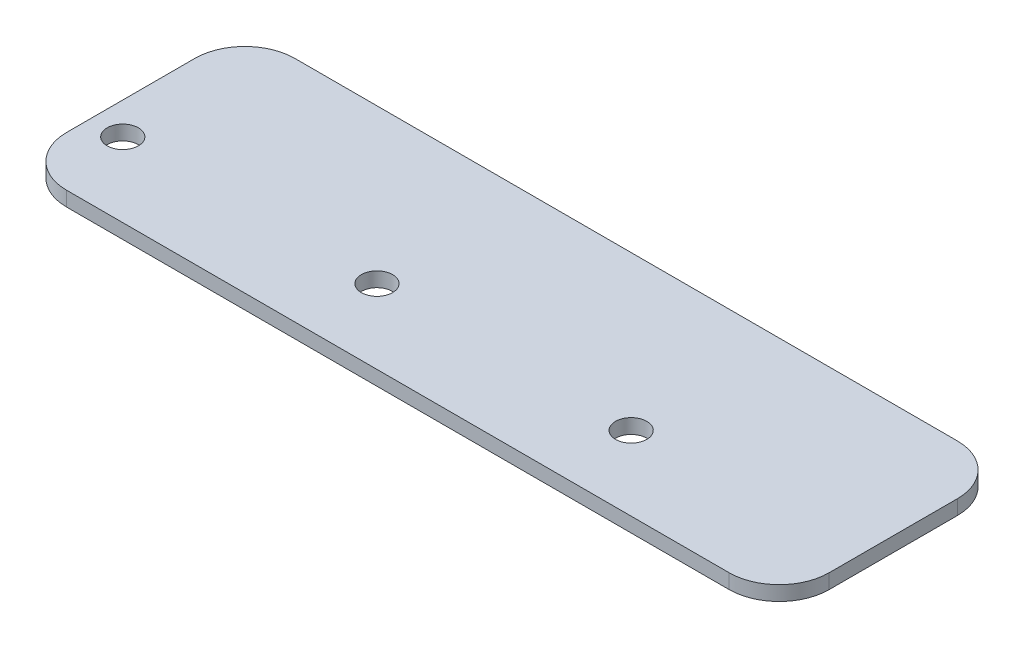
ISO-10303-21;
HEADER;
FILE_DESCRIPTION(('STEP AP214'),'2;1');
FILE_NAME('part.step','',(''),(''),'','','');
FILE_SCHEMA(('AUTOMOTIVE_DESIGN { 1 0 10303 214 1 1 1 1 }'));
ENDSEC;
DATA;
#1=APPLICATION_CONTEXT('core data for automotive mechanical design processes');
#2=APPLICATION_PROTOCOL_DEFINITION('international standard','automotive_design',2000,#1);
#3=PRODUCT_CONTEXT('',#1,'mechanical');
#4=PRODUCT('Part','Part','',(#3));
#5=PRODUCT_RELATED_PRODUCT_CATEGORY('part','',(#4));
#6=PRODUCT_DEFINITION_FORMATION('','',#4);
#7=PRODUCT_DEFINITION_CONTEXT('part definition',#1,'design');
#8=PRODUCT_DEFINITION('design','',#6,#7);
#9=PRODUCT_DEFINITION_SHAPE('','',#8);
#10=(LENGTH_UNIT() NAMED_UNIT(*) SI_UNIT(.MILLI.,.METRE.));
#11=(NAMED_UNIT(*) PLANE_ANGLE_UNIT() SI_UNIT($,.RADIAN.));
#12=(NAMED_UNIT(*) SI_UNIT($,.STERADIAN.) SOLID_ANGLE_UNIT());
#13=UNCERTAINTY_MEASURE_WITH_UNIT(LENGTH_MEASURE(1.E-05),#10,'distance_accuracy_value','');
#14=(GEOMETRIC_REPRESENTATION_CONTEXT(3) GLOBAL_UNCERTAINTY_ASSIGNED_CONTEXT((#13)) GLOBAL_UNIT_ASSIGNED_CONTEXT((#10,
#11,#12)) REPRESENTATION_CONTEXT('',''));
#15=CARTESIAN_POINT('',(0.,0.,0.));
#16=DIRECTION('',(0.,0.,1.));
#17=DIRECTION('',(1.,0.,0.));
#18=AXIS2_PLACEMENT_3D('',#15,#16,#17);
#19=CARTESIAN_POINT('',(60.96,0.,-18.2477776423407));
#20=DIRECTION('',(-1.,0.,0.));
#21=DIRECTION('',(0.,-1.,0.));
#22=AXIS2_PLACEMENT_3D('',#19,#20,#21);
#23=PLANE('',#22);
#24=DIRECTION('',(0.,0.,1.));
#25=VECTOR('',#24,1.);
#26=CARTESIAN_POINT('',(60.96,-1.16839999999995,-18.2477776423407));
#27=LINE('',#26,#25);
#28=CARTESIAN_POINT('',(60.96,-1.16840000000005,-4.));
#29=VERTEX_POINT('',#28);
#30=CARTESIAN_POINT('',(60.96,-1.16839999999997,-14.2477776423407));
#31=VERTEX_POINT('',#30);
#32=EDGE_CURVE('E156',#29,#31,#27,.F.);
#33=ORIENTED_EDGE('',*,*,#32,.T.);
#34=DIRECTION('',(0.,-1.,0.));
#35=VECTOR('',#34,1.);
#36=CARTESIAN_POINT('',(60.96,0.,-14.2477776423407));
#37=LINE('',#36,#35);
#38=CARTESIAN_POINT('',(60.96,0.,-14.2477776423407));
#39=VERTEX_POINT('',#38);
#40=EDGE_CURVE('E133',#31,#39,#37,.F.);
#41=ORIENTED_EDGE('',*,*,#40,.T.);
#42=DIRECTION('',(0.,0.,-1.));
#43=VECTOR('',#42,1.);
#44=CARTESIAN_POINT('',(60.96,0.,-8.0793776423407));
#45=LINE('',#44,#43);
#46=CARTESIAN_POINT('',(60.96,0.,-4.));
#47=VERTEX_POINT('',#46);
#48=EDGE_CURVE('E159',#47,#39,#45,.T.);
#49=ORIENTED_EDGE('',*,*,#48,.F.);
#50=DIRECTION('',(0.,1.,0.));
#51=VECTOR('',#50,1.);
#52=CARTESIAN_POINT('',(60.96,-1.1684,-4.));
#53=LINE('',#52,#51);
#54=EDGE_CURVE('E138',#47,#29,#53,.F.);
#55=ORIENTED_EDGE('',*,*,#54,.T.);
#56=EDGE_LOOP('',(#33,#41,#49,#55));
#57=FACE_BOUND('',#56,.T.);
#58=ADVANCED_FACE('F61',(#57),#23,.F.);
#59=CARTESIAN_POINT('',(0.,0.,-9.24777764234074));
#60=DIRECTION('',(1.,0.,0.));
#61=DIRECTION('',(0.,1.,0.));
#62=AXIS2_PLACEMENT_3D('',#59,#60,#61);
#63=PLANE('',#62);
#64=DIRECTION('',(0.,0.,-1.));
#65=VECTOR('',#64,1.);
#66=CARTESIAN_POINT('',(0.,-1.16840000000001,-9.24777764234074));
#67=LINE('',#66,#65);
#68=CARTESIAN_POINT('',(0.,-1.16839999999997,-14.2477776423407));
#69=VERTEX_POINT('',#68);
#70=CARTESIAN_POINT('',(0.,-1.16840000000005,-4.));
#71=VERTEX_POINT('',#70);
#72=EDGE_CURVE('E155',#69,#71,#67,.F.);
#73=ORIENTED_EDGE('',*,*,#72,.T.);
#74=DIRECTION('',(0.,1.,0.));
#75=VECTOR('',#74,1.);
#76=CARTESIAN_POINT('',(0.,0.,-4.));
#77=LINE('',#76,#75);
#78=CARTESIAN_POINT('',(0.,0.,-4.));
#79=VERTEX_POINT('',#78);
#80=EDGE_CURVE('E13',#71,#79,#77,.T.);
#81=ORIENTED_EDGE('',*,*,#80,.T.);
#82=DIRECTION('',(0.,0.,1.));
#83=VECTOR('',#82,1.);
#84=CARTESIAN_POINT('',(0.,0.,-8.0793776423407));
#85=LINE('',#84,#83);
#86=CARTESIAN_POINT('',(0.,0.,-14.2477776423407));
#87=VERTEX_POINT('',#86);
#88=EDGE_CURVE('E165',#87,#79,#85,.T.);
#89=ORIENTED_EDGE('',*,*,#88,.F.);
#90=DIRECTION('',(0.,-1.,0.));
#91=VECTOR('',#90,1.);
#92=CARTESIAN_POINT('',(0.,0.,-14.2477776423407));
#93=LINE('',#92,#91);
#94=EDGE_CURVE('E69',#87,#69,#93,.T.);
#95=ORIENTED_EDGE('',*,*,#94,.T.);
#96=EDGE_LOOP('',(#73,#81,#89,#95));
#97=FACE_BOUND('',#96,.T.);
#98=ADVANCED_FACE('F186',(#97),#63,.F.);
#99=CARTESIAN_POINT('',(0.,0.,0.));
#100=DIRECTION('',(0.,-1.,0.));
#101=DIRECTION('',(0.,0.,-1.));
#102=AXIS2_PLACEMENT_3D('',#99,#100,#101);
#103=PLANE('',#102);
#104=ORIENTED_EDGE('',*,*,#48,.T.);
#105=CARTESIAN_POINT('',(56.96,0.,-14.2477776423407));
#106=DIRECTION('',(0.,-1.,0.));
#107=DIRECTION('',(0.,0.,-1.));
#108=AXIS2_PLACEMENT_3D('',#105,#106,#107);
#109=CIRCLE('',#108,4.);
#110=CARTESIAN_POINT('',(56.96,0.,-18.2477776423407));
#111=VERTEX_POINT('',#110);
#112=EDGE_CURVE('E177',#39,#111,#109,.F.);
#113=ORIENTED_EDGE('',*,*,#112,.T.);
#114=DIRECTION('',(-1.,0.,0.));
#115=VECTOR('',#114,1.);
#116=CARTESIAN_POINT('',(0.,0.,-18.2477776423407));
#117=LINE('',#116,#115);
#118=CARTESIAN_POINT('',(4.,0.,-18.2477776423407));
#119=VERTEX_POINT('',#118);
#120=EDGE_CURVE('E148',#111,#119,#117,.T.);
#121=ORIENTED_EDGE('',*,*,#120,.T.);
#122=CARTESIAN_POINT('',(4.,0.,-14.2477776423407));
#123=DIRECTION('',(0.,-1.,0.));
#124=DIRECTION('',(0.,0.,-1.));
#125=AXIS2_PLACEMENT_3D('',#122,#123,#124);
#126=CIRCLE('',#125,4.);
#127=EDGE_CURVE('E173',#119,#87,#126,.F.);
#128=ORIENTED_EDGE('',*,*,#127,.T.);
#129=ORIENTED_EDGE('',*,*,#88,.T.);
#130=CARTESIAN_POINT('',(4.,0.,-4.));
#131=DIRECTION('',(0.,-1.,0.));
#132=DIRECTION('',(0.,0.,-1.));
#133=AXIS2_PLACEMENT_3D('',#130,#131,#132);
#134=CIRCLE('',#133,4.);
#135=CARTESIAN_POINT('',(4.,0.,0.));
#136=VERTEX_POINT('',#135);
#137=EDGE_CURVE('E84',#79,#136,#134,.F.);
#138=ORIENTED_EDGE('',*,*,#137,.T.);
#139=DIRECTION('',(1.,0.,0.));
#140=VECTOR('',#139,1.);
#141=CARTESIAN_POINT('',(0.,0.,0.));
#142=LINE('',#141,#140);
#143=CARTESIAN_POINT('',(56.96,0.,0.));
#144=VERTEX_POINT('',#143);
#145=EDGE_CURVE('E161',#136,#144,#142,.T.);
#146=ORIENTED_EDGE('',*,*,#145,.T.);
#147=CARTESIAN_POINT('',(56.96,0.,-4.));
#148=DIRECTION('',(0.,-1.,0.));
#149=DIRECTION('',(0.,0.,-1.));
#150=AXIS2_PLACEMENT_3D('',#147,#148,#149);
#151=CIRCLE('',#150,4.);
#152=EDGE_CURVE('E76',#144,#47,#151,.F.);
#153=ORIENTED_EDGE('',*,*,#152,.T.);
#154=EDGE_LOOP('',(#104,#113,#121,#128,#129,#138,#146,#153));
#155=FACE_BOUND('',#154,.T.);
#156=CARTESIAN_POINT('',(2.55,0.,-5.94));
#157=DIRECTION('',(0.,-1.,0.));
#158=DIRECTION('',(0.,0.,-1.));
#159=AXIS2_PLACEMENT_3D('',#156,#157,#158);
#160=CIRCLE('',#159,1.25);
#161=CARTESIAN_POINT('',(2.55,0.,-7.19));
#162=VERTEX_POINT('',#161);
#163=EDGE_CURVE('E221',#162,#162,#160,.T.);
#164=ORIENTED_EDGE('',*,*,#163,.T.);
#165=EDGE_LOOP('',(#164));
#166=FACE_BOUND('',#165,.T.);
#167=CARTESIAN_POINT('',(22.87,0.,-5.94));
#168=DIRECTION('',(0.,-1.,0.));
#169=DIRECTION('',(0.,0.,-1.));
#170=AXIS2_PLACEMENT_3D('',#167,#168,#169);
#171=CIRCLE('',#170,1.25);
#172=CARTESIAN_POINT('',(22.87,0.,-7.19));
#173=VERTEX_POINT('',#172);
#174=EDGE_CURVE('E224',#173,#173,#171,.T.);
#175=ORIENTED_EDGE('',*,*,#174,.T.);
#176=EDGE_LOOP('',(#175));
#177=FACE_BOUND('',#176,.T.);
#178=CARTESIAN_POINT('',(43.19,0.,-5.94));
#179=DIRECTION('',(0.,-1.,0.));
#180=DIRECTION('',(0.,0.,-1.));
#181=AXIS2_PLACEMENT_3D('',#178,#179,#180);
#182=CIRCLE('',#181,1.25);
#183=CARTESIAN_POINT('',(43.19,0.,-7.19));
#184=VERTEX_POINT('',#183);
#185=EDGE_CURVE('E227',#184,#184,#182,.T.);
#186=ORIENTED_EDGE('',*,*,#185,.T.);
#187=EDGE_LOOP('',(#186));
#188=FACE_BOUND('',#187,.T.);
#189=ADVANCED_FACE('F198',(#155,#166,#177,#188),#103,.F.);
#190=CARTESIAN_POINT('',(0.,-1.16840000000002,-8.07937764234071));
#191=DIRECTION('',(0.,-1.,0.));
#192=DIRECTION('',(0.,0.,-1.));
#193=AXIS2_PLACEMENT_3D('',#190,#191,#192);
#194=PLANE('',#193);
#195=DIRECTION('',(1.,0.,0.));
#196=VECTOR('',#195,1.);
#197=CARTESIAN_POINT('',(0.,-1.16839999999995,-18.2477776423407));
#198=LINE('',#197,#196);
#199=CARTESIAN_POINT('',(56.96,-1.16839999999995,-18.2477776423407));
#200=VERTEX_POINT('',#199);
#201=CARTESIAN_POINT('',(4.,-1.16839999999995,-18.2477776423407));
#202=VERTEX_POINT('',#201);
#203=EDGE_CURVE('E145',#200,#202,#198,.F.);
#204=ORIENTED_EDGE('',*,*,#203,.F.);
#205=CARTESIAN_POINT('',(56.96,-1.16839999999997,-14.2477776423407));
#206=DIRECTION('',(0.,-1.,0.));
#207=DIRECTION('',(0.,0.,-1.));
#208=AXIS2_PLACEMENT_3D('',#205,#206,#207);
#209=CIRCLE('',#208,4.);
#210=EDGE_CURVE('E128',#200,#31,#209,.T.);
#211=ORIENTED_EDGE('',*,*,#210,.T.);
#212=ORIENTED_EDGE('',*,*,#32,.F.);
#213=CARTESIAN_POINT('',(56.96,-1.16840000000004,-4.));
#214=DIRECTION('',(0.,-1.,0.));
#215=DIRECTION('',(0.,0.,-1.));
#216=AXIS2_PLACEMENT_3D('',#213,#214,#215);
#217=CIRCLE('',#216,4.);
#218=CARTESIAN_POINT('',(56.96,-1.1684,0.));
#219=VERTEX_POINT('',#218);
#220=EDGE_CURVE('E139',#29,#219,#217,.T.);
#221=ORIENTED_EDGE('',*,*,#220,.T.);
#222=DIRECTION('',(1.,0.,0.));
#223=VECTOR('',#222,1.);
#224=CARTESIAN_POINT('',(0.,-1.1684,0.));
#225=LINE('',#224,#223);
#226=CARTESIAN_POINT('',(4.,-1.1684,0.));
#227=VERTEX_POINT('',#226);
#228=EDGE_CURVE('E193',#227,#219,#225,.T.);
#229=ORIENTED_EDGE('',*,*,#228,.F.);
#230=CARTESIAN_POINT('',(4.,-1.16840000000004,-4.));
#231=DIRECTION('',(0.,-1.,0.));
#232=DIRECTION('',(0.,0.,-1.));
#233=AXIS2_PLACEMENT_3D('',#230,#231,#232);
#234=CIRCLE('',#233,4.);
#235=EDGE_CURVE('E168',#227,#71,#234,.T.);
#236=ORIENTED_EDGE('',*,*,#235,.T.);
#237=ORIENTED_EDGE('',*,*,#72,.F.);
#238=CARTESIAN_POINT('',(4.,-1.16839999999997,-14.2477776423407));
#239=DIRECTION('',(0.,-1.,0.));
#240=DIRECTION('',(0.,0.,-1.));
#241=AXIS2_PLACEMENT_3D('',#238,#239,#240);
#242=CIRCLE('',#241,4.);
#243=EDGE_CURVE('E149',#69,#202,#242,.T.);
#244=ORIENTED_EDGE('',*,*,#243,.T.);
#245=EDGE_LOOP('',(#204,#211,#212,#221,#229,#236,#237,#244));
#246=FACE_BOUND('',#245,.T.);
#247=CARTESIAN_POINT('',(2.55,-1.1684,-5.94));
#248=DIRECTION('',(0.,-1.,0.));
#249=DIRECTION('',(0.,0.,-1.));
#250=AXIS2_PLACEMENT_3D('',#247,#248,#249);
#251=CIRCLE('',#250,1.25);
#252=CARTESIAN_POINT('',(2.55,-1.1684,-7.19));
#253=VERTEX_POINT('',#252);
#254=EDGE_CURVE('E216',#253,#253,#251,.T.);
#255=ORIENTED_EDGE('',*,*,#254,.F.);
#256=EDGE_LOOP('',(#255));
#257=FACE_BOUND('',#256,.T.);
#258=CARTESIAN_POINT('',(22.87,-1.1684,-5.94));
#259=DIRECTION('',(0.,-1.,0.));
#260=DIRECTION('',(0.,0.,-1.));
#261=AXIS2_PLACEMENT_3D('',#258,#259,#260);
#262=CIRCLE('',#261,1.25);
#263=CARTESIAN_POINT('',(22.87,-1.1684,-7.19));
#264=VERTEX_POINT('',#263);
#265=EDGE_CURVE('E212',#264,#264,#262,.T.);
#266=ORIENTED_EDGE('',*,*,#265,.F.);
#267=EDGE_LOOP('',(#266));
#268=FACE_BOUND('',#267,.T.);
#269=CARTESIAN_POINT('',(43.19,-1.1684,-5.94));
#270=DIRECTION('',(0.,-1.,0.));
#271=DIRECTION('',(0.,0.,-1.));
#272=AXIS2_PLACEMENT_3D('',#269,#270,#271);
#273=CIRCLE('',#272,1.25);
#274=CARTESIAN_POINT('',(43.19,-1.1684,-7.19));
#275=VERTEX_POINT('',#274);
#276=EDGE_CURVE('E210',#275,#275,#273,.T.);
#277=ORIENTED_EDGE('',*,*,#276,.F.);
#278=EDGE_LOOP('',(#277));
#279=FACE_BOUND('',#278,.T.);
#280=ADVANCED_FACE('F152',(#246,#257,#268,#279),#194,.T.);
#281=CARTESIAN_POINT('',(0.,0.,-18.2477776423407));
#282=DIRECTION('',(0.,0.,1.));
#283=DIRECTION('',(0.,-1.,0.));
#284=AXIS2_PLACEMENT_3D('',#281,#282,#283);
#285=PLANE('',#284);
#286=ORIENTED_EDGE('',*,*,#120,.F.);
#287=DIRECTION('',(0.,-1.,0.));
#288=VECTOR('',#287,1.);
#289=CARTESIAN_POINT('',(56.96,0.,-18.2477776423407));
#290=LINE('',#289,#288);
#291=EDGE_CURVE('E132',#111,#200,#290,.T.);
#292=ORIENTED_EDGE('',*,*,#291,.T.);
#293=ORIENTED_EDGE('',*,*,#203,.T.);
#294=DIRECTION('',(0.,-1.,0.));
#295=VECTOR('',#294,1.);
#296=CARTESIAN_POINT('',(4.,0.,-18.2477776423407));
#297=LINE('',#296,#295);
#298=EDGE_CURVE('E150',#202,#119,#297,.F.);
#299=ORIENTED_EDGE('',*,*,#298,.T.);
#300=EDGE_LOOP('',(#286,#292,#293,#299));
#301=FACE_BOUND('',#300,.T.);
#302=ADVANCED_FACE('F144',(#301),#285,.F.);
#303=CARTESIAN_POINT('',(0.,-1.1684,0.));
#304=DIRECTION('',(0.,0.,1.));
#305=DIRECTION('',(1.,0.,0.));
#306=AXIS2_PLACEMENT_3D('',#303,#304,#305);
#307=PLANE('',#306);
#308=ORIENTED_EDGE('',*,*,#228,.T.);
#309=DIRECTION('',(0.,1.,0.));
#310=VECTOR('',#309,1.);
#311=CARTESIAN_POINT('',(56.96,0.,0.));
#312=LINE('',#311,#310);
#313=EDGE_CURVE('E181',#219,#144,#312,.T.);
#314=ORIENTED_EDGE('',*,*,#313,.T.);
#315=ORIENTED_EDGE('',*,*,#145,.F.);
#316=DIRECTION('',(0.,1.,0.));
#317=VECTOR('',#316,1.);
#318=CARTESIAN_POINT('',(4.,-1.1684,0.));
#319=LINE('',#318,#317);
#320=EDGE_CURVE('E179',#136,#227,#319,.F.);
#321=ORIENTED_EDGE('',*,*,#320,.T.);
#322=EDGE_LOOP('',(#308,#314,#315,#321));
#323=FACE_BOUND('',#322,.T.);
#324=ADVANCED_FACE('F209',(#323),#307,.T.);
#325=CARTESIAN_POINT('',(43.19,-1.1684,-5.94));
#326=DIRECTION('',(0.,-1.,0.));
#327=DIRECTION('',(0.,0.,-1.));
#328=AXIS2_PLACEMENT_3D('',#325,#326,#327);
#329=CYLINDRICAL_SURFACE('',#328,1.25);
#330=ORIENTED_EDGE('',*,*,#185,.F.);
#331=EDGE_LOOP('',(#330));
#332=FACE_BOUND('',#331,.T.);
#333=ORIENTED_EDGE('',*,*,#276,.T.);
#334=EDGE_LOOP('',(#333));
#335=FACE_BOUND('',#334,.T.);
#336=ADVANCED_FACE('F233',(#332,#335),#329,.F.);
#337=CARTESIAN_POINT('',(22.87,-1.1684,-5.94));
#338=DIRECTION('',(0.,-1.,0.));
#339=DIRECTION('',(0.,0.,-1.));
#340=AXIS2_PLACEMENT_3D('',#337,#338,#339);
#341=CYLINDRICAL_SURFACE('',#340,1.25);
#342=ORIENTED_EDGE('',*,*,#174,.F.);
#343=EDGE_LOOP('',(#342));
#344=FACE_BOUND('',#343,.T.);
#345=ORIENTED_EDGE('',*,*,#265,.T.);
#346=EDGE_LOOP('',(#345));
#347=FACE_BOUND('',#346,.T.);
#348=ADVANCED_FACE('F235',(#344,#347),#341,.F.);
#349=CARTESIAN_POINT('',(2.55,-1.1684,-5.94));
#350=DIRECTION('',(0.,-1.,0.));
#351=DIRECTION('',(0.,0.,-1.));
#352=AXIS2_PLACEMENT_3D('',#349,#350,#351);
#353=CYLINDRICAL_SURFACE('',#352,1.25);
#354=ORIENTED_EDGE('',*,*,#163,.F.);
#355=EDGE_LOOP('',(#354));
#356=FACE_BOUND('',#355,.T.);
#357=ORIENTED_EDGE('',*,*,#254,.T.);
#358=EDGE_LOOP('',(#357));
#359=FACE_BOUND('',#358,.T.);
#360=ADVANCED_FACE('F240',(#356,#359),#353,.F.);
#361=CARTESIAN_POINT('',(56.96,0.,-14.2477776423407));
#362=DIRECTION('',(0.,-1.,0.));
#363=DIRECTION('',(0.,0.,-1.));
#364=AXIS2_PLACEMENT_3D('',#361,#362,#363);
#365=CYLINDRICAL_SURFACE('',#364,4.);
#366=ORIENTED_EDGE('',*,*,#112,.F.);
#367=ORIENTED_EDGE('',*,*,#40,.F.);
#368=ORIENTED_EDGE('',*,*,#210,.F.);
#369=ORIENTED_EDGE('',*,*,#291,.F.);
#370=EDGE_LOOP('',(#366,#367,#368,#369));
#371=FACE_BOUND('',#370,.T.);
#372=ADVANCED_FACE('F131',(#371),#365,.T.);
#373=CARTESIAN_POINT('',(56.96,-1.1684,-4.));
#374=DIRECTION('',(0.,-1.,0.));
#375=DIRECTION('',(0.,0.,-1.));
#376=AXIS2_PLACEMENT_3D('',#373,#374,#375);
#377=CYLINDRICAL_SURFACE('',#376,4.);
#378=ORIENTED_EDGE('',*,*,#220,.F.);
#379=ORIENTED_EDGE('',*,*,#54,.F.);
#380=ORIENTED_EDGE('',*,*,#152,.F.);
#381=ORIENTED_EDGE('',*,*,#313,.F.);
#382=EDGE_LOOP('',(#378,#379,#380,#381));
#383=FACE_BOUND('',#382,.T.);
#384=ADVANCED_FACE('F207',(#383),#377,.T.);
#385=CARTESIAN_POINT('',(4.,0.,-4.));
#386=DIRECTION('',(0.,-1.,0.));
#387=DIRECTION('',(0.,0.,-1.));
#388=AXIS2_PLACEMENT_3D('',#385,#386,#387);
#389=CYLINDRICAL_SURFACE('',#388,4.);
#390=ORIENTED_EDGE('',*,*,#235,.F.);
#391=ORIENTED_EDGE('',*,*,#320,.F.);
#392=ORIENTED_EDGE('',*,*,#137,.F.);
#393=ORIENTED_EDGE('',*,*,#80,.F.);
#394=EDGE_LOOP('',(#390,#391,#392,#393));
#395=FACE_BOUND('',#394,.T.);
#396=ADVANCED_FACE('F196',(#395),#389,.T.);
#397=CARTESIAN_POINT('',(4.,0.,-14.2477776423407));
#398=DIRECTION('',(0.,-1.,0.));
#399=DIRECTION('',(0.,0.,-1.));
#400=AXIS2_PLACEMENT_3D('',#397,#398,#399);
#401=CYLINDRICAL_SURFACE('',#400,4.);
#402=ORIENTED_EDGE('',*,*,#127,.F.);
#403=ORIENTED_EDGE('',*,*,#298,.F.);
#404=ORIENTED_EDGE('',*,*,#243,.F.);
#405=ORIENTED_EDGE('',*,*,#94,.F.);
#406=EDGE_LOOP('',(#402,#403,#404,#405));
#407=FACE_BOUND('',#406,.T.);
#408=ADVANCED_FACE('F63',(#407),#401,.T.);
#409=CLOSED_SHELL('',(#58,#98,#189,#280,#302,#324,#336,#348,#360,#372,#384,#396,#408));
#410=MANIFOLD_SOLID_BREP('B2',#409);
#411=ADVANCED_BREP_SHAPE_REPRESENTATION('',(#18,#410),#14);
#412=SHAPE_DEFINITION_REPRESENTATION(#9,#411);
ENDSEC;
END-ISO-10303-21;
